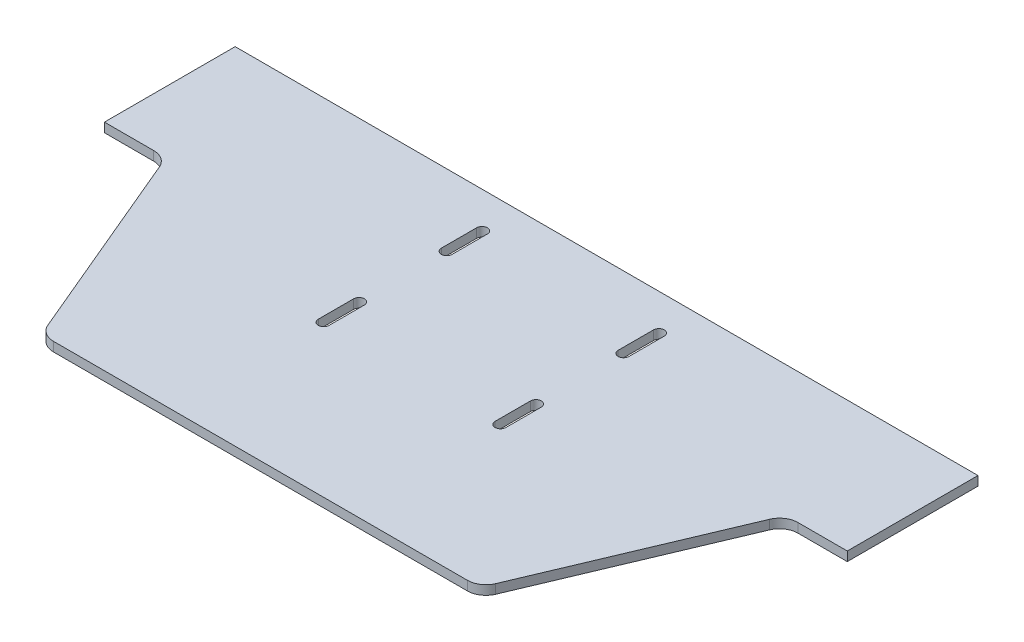
ISO-10303-21;
HEADER;
FILE_DESCRIPTION(('STEP AP214'),'2;1');
FILE_NAME('part.step','',(''),(''),'','','');
FILE_SCHEMA(('AUTOMOTIVE_DESIGN { 1 0 10303 214 1 1 1 1 }'));
ENDSEC;
DATA;
#1=APPLICATION_CONTEXT('core data for automotive mechanical design processes');
#2=APPLICATION_PROTOCOL_DEFINITION('international standard','automotive_design',2000,#1);
#3=PRODUCT_CONTEXT('',#1,'mechanical');
#4=PRODUCT('Part','Part','',(#3));
#5=PRODUCT_RELATED_PRODUCT_CATEGORY('part','',(#4));
#6=PRODUCT_DEFINITION_FORMATION('','',#4);
#7=PRODUCT_DEFINITION_CONTEXT('part definition',#1,'design');
#8=PRODUCT_DEFINITION('design','',#6,#7);
#9=PRODUCT_DEFINITION_SHAPE('','',#8);
#10=(LENGTH_UNIT() NAMED_UNIT(*) SI_UNIT(.MILLI.,.METRE.));
#11=(NAMED_UNIT(*) PLANE_ANGLE_UNIT() SI_UNIT($,.RADIAN.));
#12=(NAMED_UNIT(*) SI_UNIT($,.STERADIAN.) SOLID_ANGLE_UNIT());
#13=UNCERTAINTY_MEASURE_WITH_UNIT(LENGTH_MEASURE(1.E-05),#10,'distance_accuracy_value','');
#14=(GEOMETRIC_REPRESENTATION_CONTEXT(3) GLOBAL_UNCERTAINTY_ASSIGNED_CONTEXT((#13)) GLOBAL_UNIT_ASSIGNED_CONTEXT((#10,
#11,#12)) REPRESENTATION_CONTEXT('',''));
#15=CARTESIAN_POINT('',(0.,0.,0.));
#16=DIRECTION('',(0.,0.,1.));
#17=DIRECTION('',(1.,0.,0.));
#18=AXIS2_PLACEMENT_3D('',#15,#16,#17);
#19=CARTESIAN_POINT('',(-241.501482209097,-55.4959188693304,165.));
#20=DIRECTION('',(1.,0.,0.));
#21=DIRECTION('',(0.,0.,-1.));
#22=AXIS2_PLACEMENT_3D('',#19,#20,#21);
#23=PLANE('',#22);
#24=DIRECTION('',(0.,0.,1.));
#25=VECTOR('',#24,1.);
#26=CARTESIAN_POINT('',(-241.501482209097,-61.4959188693304,165.));
#27=LINE('',#26,#25);
#28=CARTESIAN_POINT('',(-241.501482209097,-61.4959188693304,80.));
#29=VERTEX_POINT('',#28);
#30=CARTESIAN_POINT('',(-241.501482209097,-61.4959188693304,165.));
#31=VERTEX_POINT('',#30);
#32=EDGE_CURVE('E345',#29,#31,#27,.T.);
#33=ORIENTED_EDGE('',*,*,#32,.T.);
#34=DIRECTION('',(0.,-1.,0.));
#35=VECTOR('',#34,1.);
#36=CARTESIAN_POINT('',(-241.501482209097,-55.4959188693304,165.));
#37=LINE('',#36,#35);
#38=CARTESIAN_POINT('',(-241.501482209097,-55.4959188693304,165.));
#39=VERTEX_POINT('',#38);
#40=EDGE_CURVE('E396',#39,#31,#37,.T.);
#41=ORIENTED_EDGE('',*,*,#40,.F.);
#42=DIRECTION('',(0.,0.,1.));
#43=VECTOR('',#42,1.);
#44=CARTESIAN_POINT('',(-241.501482209097,-55.4959188693304,165.));
#45=LINE('',#44,#43);
#46=CARTESIAN_POINT('',(-241.501482209097,-55.4959188693304,80.));
#47=VERTEX_POINT('',#46);
#48=EDGE_CURVE('E346',#47,#39,#45,.T.);
#49=ORIENTED_EDGE('',*,*,#48,.F.);
#50=DIRECTION('',(0.,-1.,0.));
#51=VECTOR('',#50,1.);
#52=CARTESIAN_POINT('',(-241.501482209097,-55.4959188693304,80.));
#53=LINE('',#52,#51);
#54=EDGE_CURVE('E368',#47,#29,#53,.T.);
#55=ORIENTED_EDGE('',*,*,#54,.T.);
#56=EDGE_LOOP('',(#33,#41,#49,#55));
#57=FACE_BOUND('',#56,.T.);
#58=ADVANCED_FACE('F32',(#57),#23,.F.);
#59=CARTESIAN_POINT('',(-201.501482209097,-55.4959188693304,165.));
#60=DIRECTION('',(0.,0.,-1.));
#61=DIRECTION('',(-1.,0.,0.));
#62=AXIS2_PLACEMENT_3D('',#59,#60,#61);
#63=PLANE('',#62);
#64=DIRECTION('',(1.,0.,0.));
#65=VECTOR('',#64,1.);
#66=CARTESIAN_POINT('',(-201.501482209097,-61.4959188693304,165.));
#67=LINE('',#66,#65);
#68=CARTESIAN_POINT('',(-209.466346496069,-61.4959188693304,165.));
#69=VERTEX_POINT('',#68);
#70=EDGE_CURVE('E371',#31,#69,#67,.T.);
#71=ORIENTED_EDGE('',*,*,#70,.T.);
#72=DIRECTION('',(0.,-1.,0.));
#73=VECTOR('',#72,1.);
#74=CARTESIAN_POINT('',(-209.466346496069,-55.4959188693304,165.));
#75=LINE('',#74,#73);
#76=CARTESIAN_POINT('',(-209.466346496069,-55.4959188693304,165.));
#77=VERTEX_POINT('',#76);
#78=EDGE_CURVE('E404',#69,#77,#75,.F.);
#79=ORIENTED_EDGE('',*,*,#78,.T.);
#80=DIRECTION('',(1.,0.,0.));
#81=VECTOR('',#80,1.);
#82=CARTESIAN_POINT('',(-201.501482209097,-55.4959188693304,165.));
#83=LINE('',#82,#81);
#84=EDGE_CURVE('E349',#39,#77,#83,.T.);
#85=ORIENTED_EDGE('',*,*,#84,.F.);
#86=ORIENTED_EDGE('',*,*,#40,.T.);
#87=EDGE_LOOP('',(#71,#79,#85,#86));
#88=FACE_BOUND('',#87,.T.);
#89=ADVANCED_FACE('F463',(#88),#63,.F.);
#90=CARTESIAN_POINT('',(-142.5,-55.4959188693304,305.));
#91=DIRECTION('',(0.921507935976713,0.,-0.388359529214797));
#92=DIRECTION('',(-0.388359529214797,0.,-0.921507935976713));
#93=AXIS2_PLACEMENT_3D('',#90,#91,#92);
#94=PLANE('',#93);
#95=DIRECTION('',(0.388359529214797,0.,0.921507935976713));
#96=VECTOR('',#95,1.);
#97=CARTESIAN_POINT('',(-142.5,-55.4959188693304,305.));
#98=LINE('',#97,#96);
#99=CARTESIAN_POINT('',(-198.408251264349,-55.4959188693304,172.339685649422));
#100=VERTEX_POINT('',#99);
#101=CARTESIAN_POINT('',(-145.593230944748,-55.4959188693304,297.660314350578));
#102=VERTEX_POINT('',#101);
#103=EDGE_CURVE('E353',#100,#102,#98,.T.);
#104=ORIENTED_EDGE('',*,*,#103,.F.);
#105=DIRECTION('',(0.,-1.,0.));
#106=VECTOR('',#105,1.);
#107=CARTESIAN_POINT('',(-198.408251264349,-61.4959188693304,172.339685649422));
#108=LINE('',#107,#106);
#109=CARTESIAN_POINT('',(-198.408251264349,-61.4959188693304,172.339685649422));
#110=VERTEX_POINT('',#109);
#111=EDGE_CURVE('E401',#100,#110,#108,.T.);
#112=ORIENTED_EDGE('',*,*,#111,.T.);
#113=DIRECTION('',(0.388359529214797,0.,0.921507935976713));
#114=VECTOR('',#113,1.);
#115=CARTESIAN_POINT('',(-142.5,-61.4959188693304,305.));
#116=LINE('',#115,#114);
#117=CARTESIAN_POINT('',(-145.593230944748,-61.4959188693304,297.660314350578));
#118=VERTEX_POINT('',#117);
#119=EDGE_CURVE('E374',#110,#118,#116,.T.);
#120=ORIENTED_EDGE('',*,*,#119,.T.);
#121=DIRECTION('',(0.,-1.,0.));
#122=VECTOR('',#121,1.);
#123=CARTESIAN_POINT('',(-145.593230944748,-55.4959188693304,297.660314350578));
#124=LINE('',#123,#122);
#125=EDGE_CURVE('E399',#118,#102,#124,.F.);
#126=ORIENTED_EDGE('',*,*,#125,.T.);
#127=EDGE_LOOP('',(#104,#112,#120,#126));
#128=FACE_BOUND('',#127,.T.);
#129=ADVANCED_FACE('F472',(#128),#94,.F.);
#130=CARTESIAN_POINT('',(142.5,-55.4959188693304,305.));
#131=DIRECTION('',(0.,0.,-1.));
#132=DIRECTION('',(-1.,0.,0.));
#133=AXIS2_PLACEMENT_3D('',#130,#131,#132);
#134=PLANE('',#133);
#135=DIRECTION('',(1.,0.,0.));
#136=VECTOR('',#135,1.);
#137=CARTESIAN_POINT('',(142.5,-55.4959188693304,305.));
#138=LINE('',#137,#136);
#139=CARTESIAN_POINT('',(-134.535135713028,-55.4959188693304,305.));
#140=VERTEX_POINT('',#139);
#141=CARTESIAN_POINT('',(134.535135713028,-55.4959188693304,305.));
#142=VERTEX_POINT('',#141);
#143=EDGE_CURVE('E356',#140,#142,#138,.T.);
#144=ORIENTED_EDGE('',*,*,#143,.F.);
#145=DIRECTION('',(0.,-1.,0.));
#146=VECTOR('',#145,1.);
#147=CARTESIAN_POINT('',(-134.535135713028,-55.4959188693304,305.));
#148=LINE('',#147,#146);
#149=CARTESIAN_POINT('',(-134.535135713028,-61.4959188693304,305.));
#150=VERTEX_POINT('',#149);
#151=EDGE_CURVE('E408',#140,#150,#148,.T.);
#152=ORIENTED_EDGE('',*,*,#151,.T.);
#153=DIRECTION('',(1.,0.,0.));
#154=VECTOR('',#153,1.);
#155=CARTESIAN_POINT('',(142.5,-61.4959188693304,305.));
#156=LINE('',#155,#154);
#157=CARTESIAN_POINT('',(134.535135713028,-61.4959188693304,305.));
#158=VERTEX_POINT('',#157);
#159=EDGE_CURVE('E377',#150,#158,#156,.T.);
#160=ORIENTED_EDGE('',*,*,#159,.T.);
#161=DIRECTION('',(0.,-1.,0.));
#162=VECTOR('',#161,1.);
#163=CARTESIAN_POINT('',(134.535135713028,-55.4959188693304,305.));
#164=LINE('',#163,#162);
#165=EDGE_CURVE('E406',#158,#142,#164,.F.);
#166=ORIENTED_EDGE('',*,*,#165,.T.);
#167=EDGE_LOOP('',(#144,#152,#160,#166));
#168=FACE_BOUND('',#167,.T.);
#169=ADVANCED_FACE('F480',(#168),#134,.F.);
#170=CARTESIAN_POINT('',(201.501482209097,-55.4959188693304,165.));
#171=DIRECTION('',(-0.921507935976713,0.,-0.388359529214797));
#172=DIRECTION('',(-0.388359529214797,0.,0.921507935976713));
#173=AXIS2_PLACEMENT_3D('',#170,#171,#172);
#174=PLANE('',#173);
#175=DIRECTION('',(0.388359529214797,0.,-0.921507935976713));
#176=VECTOR('',#175,1.);
#177=CARTESIAN_POINT('',(201.501482209097,-55.4959188693304,165.));
#178=LINE('',#177,#176);
#179=CARTESIAN_POINT('',(145.593230944748,-55.4959188693304,297.660314350577));
#180=VERTEX_POINT('',#179);
#181=CARTESIAN_POINT('',(198.408251264349,-55.4959188693304,172.339685649422));
#182=VERTEX_POINT('',#181);
#183=EDGE_CURVE('E359',#180,#182,#178,.T.);
#184=ORIENTED_EDGE('',*,*,#183,.F.);
#185=DIRECTION('',(0.,-1.,0.));
#186=VECTOR('',#185,1.);
#187=CARTESIAN_POINT('',(145.593230944748,-55.4959188693304,297.660314350578));
#188=LINE('',#187,#186);
#189=CARTESIAN_POINT('',(145.593230944748,-61.4959188693304,297.660314350577));
#190=VERTEX_POINT('',#189);
#191=EDGE_CURVE('E421',#180,#190,#188,.T.);
#192=ORIENTED_EDGE('',*,*,#191,.T.);
#193=DIRECTION('',(0.388359529214797,0.,-0.921507935976713));
#194=VECTOR('',#193,1.);
#195=CARTESIAN_POINT('',(201.501482209097,-61.4959188693304,165.));
#196=LINE('',#195,#194);
#197=CARTESIAN_POINT('',(198.408251264349,-61.4959188693304,172.339685649422));
#198=VERTEX_POINT('',#197);
#199=EDGE_CURVE('E380',#190,#198,#196,.T.);
#200=ORIENTED_EDGE('',*,*,#199,.T.);
#201=DIRECTION('',(0.,-1.,0.));
#202=VECTOR('',#201,1.);
#203=CARTESIAN_POINT('',(198.408251264349,-55.4959188693304,172.339685649422));
#204=LINE('',#203,#202);
#205=EDGE_CURVE('E419',#198,#182,#204,.F.);
#206=ORIENTED_EDGE('',*,*,#205,.T.);
#207=EDGE_LOOP('',(#184,#192,#200,#206));
#208=FACE_BOUND('',#207,.T.);
#209=ADVANCED_FACE('F441',(#208),#174,.F.);
#210=CARTESIAN_POINT('',(241.501482209097,-55.4959188693304,165.));
#211=DIRECTION('',(0.,0.,-1.));
#212=DIRECTION('',(-1.,0.,0.));
#213=AXIS2_PLACEMENT_3D('',#210,#211,#212);
#214=PLANE('',#213);
#215=DIRECTION('',(1.,0.,0.));
#216=VECTOR('',#215,1.);
#217=CARTESIAN_POINT('',(241.501482209097,-55.4959188693304,165.));
#218=LINE('',#217,#216);
#219=CARTESIAN_POINT('',(209.466346496069,-55.4959188693304,165.));
#220=VERTEX_POINT('',#219);
#221=CARTESIAN_POINT('',(241.501482209097,-55.4959188693304,165.));
#222=VERTEX_POINT('',#221);
#223=EDGE_CURVE('E362',#220,#222,#218,.T.);
#224=ORIENTED_EDGE('',*,*,#223,.F.);
#225=DIRECTION('',(0.,-1.,0.));
#226=VECTOR('',#225,1.);
#227=CARTESIAN_POINT('',(209.466346496069,-61.4959188693304,165.));
#228=LINE('',#227,#226);
#229=CARTESIAN_POINT('',(209.466346496069,-61.4959188693304,165.));
#230=VERTEX_POINT('',#229);
#231=EDGE_CURVE('E424',#220,#230,#228,.T.);
#232=ORIENTED_EDGE('',*,*,#231,.T.);
#233=DIRECTION('',(1.,0.,0.));
#234=VECTOR('',#233,1.);
#235=CARTESIAN_POINT('',(241.501482209097,-61.4959188693304,165.));
#236=LINE('',#235,#234);
#237=CARTESIAN_POINT('',(241.501482209097,-61.4959188693304,165.));
#238=VERTEX_POINT('',#237);
#239=EDGE_CURVE('E383',#230,#238,#236,.T.);
#240=ORIENTED_EDGE('',*,*,#239,.T.);
#241=DIRECTION('',(0.,-1.,0.));
#242=VECTOR('',#241,1.);
#243=CARTESIAN_POINT('',(241.501482209097,-55.4959188693304,165.));
#244=LINE('',#243,#242);
#245=EDGE_CURVE('E393',#222,#238,#244,.T.);
#246=ORIENTED_EDGE('',*,*,#245,.F.);
#247=EDGE_LOOP('',(#224,#232,#240,#246));
#248=FACE_BOUND('',#247,.T.);
#249=ADVANCED_FACE('F448',(#248),#214,.F.);
#250=CARTESIAN_POINT('',(241.501482209097,-55.4959188693304,80.));
#251=DIRECTION('',(-1.,0.,0.));
#252=DIRECTION('',(0.,0.,1.));
#253=AXIS2_PLACEMENT_3D('',#250,#251,#252);
#254=PLANE('',#253);
#255=DIRECTION('',(0.,0.,-1.));
#256=VECTOR('',#255,1.);
#257=CARTESIAN_POINT('',(241.501482209097,-61.4959188693304,80.));
#258=LINE('',#257,#256);
#259=CARTESIAN_POINT('',(241.501482209097,-61.4959188693304,80.));
#260=VERTEX_POINT('',#259);
#261=EDGE_CURVE('E385',#238,#260,#258,.T.);
#262=ORIENTED_EDGE('',*,*,#261,.T.);
#263=DIRECTION('',(0.,-1.,0.));
#264=VECTOR('',#263,1.);
#265=CARTESIAN_POINT('',(241.501482209097,-55.4959188693304,80.));
#266=LINE('',#265,#264);
#267=CARTESIAN_POINT('',(241.501482209097,-55.4959188693304,80.));
#268=VERTEX_POINT('',#267);
#269=EDGE_CURVE('E390',#268,#260,#266,.T.);
#270=ORIENTED_EDGE('',*,*,#269,.F.);
#271=DIRECTION('',(0.,0.,-1.));
#272=VECTOR('',#271,1.);
#273=CARTESIAN_POINT('',(241.501482209097,-55.4959188693304,80.));
#274=LINE('',#273,#272);
#275=EDGE_CURVE('E364',#222,#268,#274,.T.);
#276=ORIENTED_EDGE('',*,*,#275,.F.);
#277=ORIENTED_EDGE('',*,*,#245,.T.);
#278=EDGE_LOOP('',(#262,#270,#276,#277));
#279=FACE_BOUND('',#278,.T.);
#280=ADVANCED_FACE('F452',(#279),#254,.F.);
#281=CARTESIAN_POINT('',(-241.501482209097,-55.4959188693304,80.));
#282=DIRECTION('',(0.,0.,1.));
#283=DIRECTION('',(1.,0.,0.));
#284=AXIS2_PLACEMENT_3D('',#281,#282,#283);
#285=PLANE('',#284);
#286=DIRECTION('',(-1.,0.,0.));
#287=VECTOR('',#286,1.);
#288=CARTESIAN_POINT('',(-241.501482209097,-61.4959188693304,80.));
#289=LINE('',#288,#287);
#290=EDGE_CURVE('E350',#260,#29,#289,.T.);
#291=ORIENTED_EDGE('',*,*,#290,.T.);
#292=ORIENTED_EDGE('',*,*,#54,.F.);
#293=DIRECTION('',(-1.,0.,0.));
#294=VECTOR('',#293,1.);
#295=CARTESIAN_POINT('',(-241.501482209097,-55.4959188693304,80.));
#296=LINE('',#295,#294);
#297=EDGE_CURVE('E366',#268,#47,#296,.T.);
#298=ORIENTED_EDGE('',*,*,#297,.F.);
#299=ORIENTED_EDGE('',*,*,#269,.T.);
#300=EDGE_LOOP('',(#291,#292,#298,#299));
#301=FACE_BOUND('',#300,.T.);
#302=ADVANCED_FACE('F458',(#301),#285,.F.);
#303=CARTESIAN_POINT('',(-241.501482209097,-55.4959188693304,80.));
#304=DIRECTION('',(0.,-1.,0.));
#305=DIRECTION('',(0.,0.,-1.));
#306=AXIS2_PLACEMENT_3D('',#303,#304,#305);
#307=PLANE('',#306);
#308=DIRECTION('',(0.,0.,1.));
#309=VECTOR('',#308,1.);
#310=CARTESIAN_POINT('',(54.,-55.4959188693304,206.472135954998));
#311=LINE('',#310,#309);
#312=CARTESIAN_POINT('',(54.,-55.4959188693304,183.472135954998));
#313=VERTEX_POINT('',#312);
#314=CARTESIAN_POINT('',(54.,-55.4959188693304,206.472135954998));
#315=VERTEX_POINT('',#314);
#316=EDGE_CURVE('E236',#313,#315,#311,.T.);
#317=ORIENTED_EDGE('',*,*,#316,.F.);
#318=CARTESIAN_POINT('',(57.5,-55.4959188693304,183.472135954998));
#319=DIRECTION('',(0.,-1.,0.));
#320=DIRECTION('',(0.,0.,-1.));
#321=AXIS2_PLACEMENT_3D('',#318,#319,#320);
#322=CIRCLE('',#321,3.50000000000001);
#323=CARTESIAN_POINT('',(61.,-55.4959188693304,183.472135954998));
#324=VERTEX_POINT('',#323);
#325=EDGE_CURVE('E218',#324,#313,#322,.F.);
#326=ORIENTED_EDGE('',*,*,#325,.F.);
#327=DIRECTION('',(0.,0.,-1.));
#328=VECTOR('',#327,1.);
#329=CARTESIAN_POINT('',(61.,-55.4959188693304,183.472135954998));
#330=LINE('',#329,#328);
#331=CARTESIAN_POINT('',(61.,-55.4959188693304,206.472135954998));
#332=VERTEX_POINT('',#331);
#333=EDGE_CURVE('E227',#332,#324,#330,.T.);
#334=ORIENTED_EDGE('',*,*,#333,.F.);
#335=CARTESIAN_POINT('',(57.5,-55.4959188693304,206.472135954998));
#336=DIRECTION('',(0.,-1.,0.));
#337=DIRECTION('',(0.,0.,-1.));
#338=AXIS2_PLACEMENT_3D('',#335,#336,#337);
#339=CIRCLE('',#338,3.50000000000001);
#340=EDGE_CURVE('E47',#315,#332,#339,.F.);
#341=ORIENTED_EDGE('',*,*,#340,.F.);
#342=EDGE_LOOP('',(#317,#326,#334,#341));
#343=FACE_BOUND('',#342,.T.);
#344=DIRECTION('',(0.,0.,-1.));
#345=VECTOR('',#344,1.);
#346=CARTESIAN_POINT('',(61.,-55.4959188693304,126.472135954998));
#347=LINE('',#346,#345);
#348=CARTESIAN_POINT('',(61.,-55.4959188693304,126.472135954998));
#349=VERTEX_POINT('',#348);
#350=CARTESIAN_POINT('',(61.,-55.4959188693304,103.472135954998));
#351=VERTEX_POINT('',#350);
#352=EDGE_CURVE('E254',#349,#351,#347,.T.);
#353=ORIENTED_EDGE('',*,*,#352,.F.);
#354=CARTESIAN_POINT('',(57.5,-55.4959188693304,126.472135954998));
#355=DIRECTION('',(0.,-1.,0.));
#356=DIRECTION('',(0.,0.,-1.));
#357=AXIS2_PLACEMENT_3D('',#354,#355,#356);
#358=CIRCLE('',#357,3.50000000000001);
#359=CARTESIAN_POINT('',(54.,-55.4959188693304,126.472135954998));
#360=VERTEX_POINT('',#359);
#361=EDGE_CURVE('E257',#360,#349,#358,.F.);
#362=ORIENTED_EDGE('',*,*,#361,.F.);
#363=DIRECTION('',(0.,0.,1.));
#364=VECTOR('',#363,1.);
#365=CARTESIAN_POINT('',(54.,-55.4959188693304,103.472135954998));
#366=LINE('',#365,#364);
#367=CARTESIAN_POINT('',(54.,-55.4959188693304,103.472135954998));
#368=VERTEX_POINT('',#367);
#369=EDGE_CURVE('E274',#368,#360,#366,.T.);
#370=ORIENTED_EDGE('',*,*,#369,.F.);
#371=CARTESIAN_POINT('',(57.5,-55.4959188693304,103.472135954998));
#372=DIRECTION('',(0.,-1.,0.));
#373=DIRECTION('',(0.,0.,-1.));
#374=AXIS2_PLACEMENT_3D('',#371,#372,#373);
#375=CIRCLE('',#374,3.50000000000001);
#376=EDGE_CURVE('E230',#351,#368,#375,.F.);
#377=ORIENTED_EDGE('',*,*,#376,.F.);
#378=EDGE_LOOP('',(#353,#362,#370,#377));
#379=FACE_BOUND('',#378,.T.);
#380=DIRECTION('',(0.,0.,1.));
#381=VECTOR('',#380,1.);
#382=CARTESIAN_POINT('',(-61.,-55.4959188693304,126.472135954998));
#383=LINE('',#382,#381);
#384=CARTESIAN_POINT('',(-61.,-55.4959188693304,103.472135954998));
#385=VERTEX_POINT('',#384);
#386=CARTESIAN_POINT('',(-61.,-55.4959188693304,126.472135954998));
#387=VERTEX_POINT('',#386);
#388=EDGE_CURVE('E285',#385,#387,#383,.T.);
#389=ORIENTED_EDGE('',*,*,#388,.F.);
#390=CARTESIAN_POINT('',(-57.5,-55.4959188693304,103.472135954998));
#391=DIRECTION('',(0.,-1.,0.));
#392=DIRECTION('',(0.,0.,-1.));
#393=AXIS2_PLACEMENT_3D('',#390,#391,#392);
#394=CIRCLE('',#393,3.5);
#395=CARTESIAN_POINT('',(-54.,-55.4959188693304,103.472135954998));
#396=VERTEX_POINT('',#395);
#397=EDGE_CURVE('E288',#396,#385,#394,.F.);
#398=ORIENTED_EDGE('',*,*,#397,.F.);
#399=DIRECTION('',(0.,0.,-1.));
#400=VECTOR('',#399,1.);
#401=CARTESIAN_POINT('',(-54.,-55.4959188693304,103.472135954998));
#402=LINE('',#401,#400);
#403=CARTESIAN_POINT('',(-54.,-55.4959188693304,126.472135954998));
#404=VERTEX_POINT('',#403);
#405=EDGE_CURVE('E305',#404,#396,#402,.T.);
#406=ORIENTED_EDGE('',*,*,#405,.F.);
#407=CARTESIAN_POINT('',(-57.5,-55.4959188693304,126.472135954998));
#408=DIRECTION('',(0.,-1.,0.));
#409=DIRECTION('',(0.,0.,-1.));
#410=AXIS2_PLACEMENT_3D('',#407,#408,#409);
#411=CIRCLE('',#410,3.5);
#412=EDGE_CURVE('E283',#387,#404,#411,.F.);
#413=ORIENTED_EDGE('',*,*,#412,.F.);
#414=EDGE_LOOP('',(#389,#398,#406,#413));
#415=FACE_BOUND('',#414,.T.);
#416=DIRECTION('',(0.,0.,1.));
#417=VECTOR('',#416,1.);
#418=CARTESIAN_POINT('',(-61.,-55.4959188693304,183.472135954998));
#419=LINE('',#418,#417);
#420=CARTESIAN_POINT('',(-61.,-55.4959188693304,183.472135954998));
#421=VERTEX_POINT('',#420);
#422=CARTESIAN_POINT('',(-61.,-55.4959188693304,206.472135954998));
#423=VERTEX_POINT('',#422);
#424=EDGE_CURVE('E316',#421,#423,#419,.T.);
#425=ORIENTED_EDGE('',*,*,#424,.F.);
#426=CARTESIAN_POINT('',(-57.5,-55.4959188693304,183.472135954998));
#427=DIRECTION('',(0.,-1.,0.));
#428=DIRECTION('',(0.,0.,-1.));
#429=AXIS2_PLACEMENT_3D('',#426,#427,#428);
#430=CIRCLE('',#429,3.5);
#431=CARTESIAN_POINT('',(-54.,-55.4959188693304,183.472135954998));
#432=VERTEX_POINT('',#431);
#433=EDGE_CURVE('E319',#432,#421,#430,.F.);
#434=ORIENTED_EDGE('',*,*,#433,.F.);
#435=DIRECTION('',(0.,0.,-1.));
#436=VECTOR('',#435,1.);
#437=CARTESIAN_POINT('',(-54.,-55.4959188693304,206.472135954998));
#438=LINE('',#437,#436);
#439=CARTESIAN_POINT('',(-54.,-55.4959188693304,206.472135954998));
#440=VERTEX_POINT('',#439);
#441=EDGE_CURVE('E336',#440,#432,#438,.T.);
#442=ORIENTED_EDGE('',*,*,#441,.F.);
#443=CARTESIAN_POINT('',(-57.5,-55.4959188693304,206.472135954998));
#444=DIRECTION('',(0.,-1.,0.));
#445=DIRECTION('',(0.,0.,-1.));
#446=AXIS2_PLACEMENT_3D('',#443,#444,#445);
#447=CIRCLE('',#446,3.50000000000001);
#448=EDGE_CURVE('E314',#423,#440,#447,.F.);
#449=ORIENTED_EDGE('',*,*,#448,.F.);
#450=EDGE_LOOP('',(#425,#434,#442,#449));
#451=FACE_BOUND('',#450,.T.);
#452=ORIENTED_EDGE('',*,*,#103,.T.);
#453=CARTESIAN_POINT('',(-134.535135713028,-55.4959188693304,293.));
#454=DIRECTION('',(0.,-1.,0.));
#455=DIRECTION('',(0.,0.,-1.));
#456=AXIS2_PLACEMENT_3D('',#453,#454,#455);
#457=CIRCLE('',#456,12.);
#458=EDGE_CURVE('E417',#102,#140,#457,.F.);
#459=ORIENTED_EDGE('',*,*,#458,.T.);
#460=ORIENTED_EDGE('',*,*,#143,.T.);
#461=CARTESIAN_POINT('',(134.535135713028,-55.4959188693304,293.));
#462=DIRECTION('',(0.,-1.,0.));
#463=DIRECTION('',(0.,0.,-1.));
#464=AXIS2_PLACEMENT_3D('',#461,#462,#463);
#465=CIRCLE('',#464,12.);
#466=EDGE_CURVE('E415',#142,#180,#465,.F.);
#467=ORIENTED_EDGE('',*,*,#466,.T.);
#468=ORIENTED_EDGE('',*,*,#183,.T.);
#469=CARTESIAN_POINT('',(209.466346496069,-55.4959188693304,177.));
#470=DIRECTION('',(0.,-1.,0.));
#471=DIRECTION('',(0.,0.,-1.));
#472=AXIS2_PLACEMENT_3D('',#469,#470,#471);
#473=CIRCLE('',#472,12.);
#474=EDGE_CURVE('E11',#182,#220,#473,.T.);
#475=ORIENTED_EDGE('',*,*,#474,.T.);
#476=ORIENTED_EDGE('',*,*,#223,.T.);
#477=ORIENTED_EDGE('',*,*,#275,.T.);
#478=ORIENTED_EDGE('',*,*,#297,.T.);
#479=ORIENTED_EDGE('',*,*,#48,.T.);
#480=ORIENTED_EDGE('',*,*,#84,.T.);
#481=CARTESIAN_POINT('',(-209.466346496069,-55.4959188693304,177.));
#482=DIRECTION('',(0.,-1.,0.));
#483=DIRECTION('',(0.,0.,-1.));
#484=AXIS2_PLACEMENT_3D('',#481,#482,#483);
#485=CIRCLE('',#484,12.);
#486=EDGE_CURVE('E429',#77,#100,#485,.T.);
#487=ORIENTED_EDGE('',*,*,#486,.T.);
#488=EDGE_LOOP('',(#452,#459,#460,#467,#468,#475,#476,#477,#478,#479,#480,#487));
#489=FACE_BOUND('',#488,.T.);
#490=ADVANCED_FACE('F233',(#343,#379,#415,#451,#489),#307,.F.);
#491=CARTESIAN_POINT('',(-241.501482209097,-61.4959188693304,80.));
#492=DIRECTION('',(0.,-1.,0.));
#493=DIRECTION('',(0.,0.,-1.));
#494=AXIS2_PLACEMENT_3D('',#491,#492,#493);
#495=PLANE('',#494);
#496=CARTESIAN_POINT('',(57.5,-61.4959188693304,183.472135954998));
#497=DIRECTION('',(0.,-1.,0.));
#498=DIRECTION('',(0.,0.,1.));
#499=AXIS2_PLACEMENT_3D('',#496,#497,#498);
#500=CIRCLE('',#499,3.50000000000001);
#501=CARTESIAN_POINT('',(54.,-61.4959188693304,183.472135954998));
#502=VERTEX_POINT('',#501);
#503=CARTESIAN_POINT('',(61.,-61.4959188693304,183.472135954998));
#504=VERTEX_POINT('',#503);
#505=EDGE_CURVE('E55',#502,#504,#500,.T.);
#506=ORIENTED_EDGE('',*,*,#505,.F.);
#507=DIRECTION('',(0.,0.,-1.));
#508=VECTOR('',#507,1.);
#509=CARTESIAN_POINT('',(54.,-61.4959188693304,206.472135954998));
#510=LINE('',#509,#508);
#511=CARTESIAN_POINT('',(54.,-61.4959188693304,206.472135954998));
#512=VERTEX_POINT('',#511);
#513=EDGE_CURVE('E224',#512,#502,#510,.T.);
#514=ORIENTED_EDGE('',*,*,#513,.F.);
#515=CARTESIAN_POINT('',(57.5,-61.4959188693304,206.472135954998));
#516=DIRECTION('',(0.,-1.,0.));
#517=DIRECTION('',(0.,0.,1.));
#518=AXIS2_PLACEMENT_3D('',#515,#516,#517);
#519=CIRCLE('',#518,3.50000000000001);
#520=CARTESIAN_POINT('',(61.,-61.4959188693304,206.472135954998));
#521=VERTEX_POINT('',#520);
#522=EDGE_CURVE('E244',#521,#512,#519,.T.);
#523=ORIENTED_EDGE('',*,*,#522,.F.);
#524=DIRECTION('',(0.,0.,1.));
#525=VECTOR('',#524,1.);
#526=CARTESIAN_POINT('',(61.,-61.4959188693304,183.472135954998));
#527=LINE('',#526,#525);
#528=EDGE_CURVE('E238',#504,#521,#527,.T.);
#529=ORIENTED_EDGE('',*,*,#528,.F.);
#530=EDGE_LOOP('',(#506,#514,#523,#529));
#531=FACE_BOUND('',#530,.T.);
#532=CARTESIAN_POINT('',(57.5,-61.4959188693304,126.472135954998));
#533=DIRECTION('',(0.,-1.,0.));
#534=DIRECTION('',(0.,0.,-1.));
#535=AXIS2_PLACEMENT_3D('',#532,#533,#534);
#536=CIRCLE('',#535,3.50000000000001);
#537=CARTESIAN_POINT('',(61.,-61.4959188693304,126.472135954998));
#538=VERTEX_POINT('',#537);
#539=CARTESIAN_POINT('',(54.,-61.4959188693304,126.472135954998));
#540=VERTEX_POINT('',#539);
#541=EDGE_CURVE('E260',#538,#540,#536,.T.);
#542=ORIENTED_EDGE('',*,*,#541,.F.);
#543=DIRECTION('',(0.,0.,1.));
#544=VECTOR('',#543,1.);
#545=CARTESIAN_POINT('',(61.,-61.4959188693304,126.472135954998));
#546=LINE('',#545,#544);
#547=CARTESIAN_POINT('',(61.,-61.4959188693304,103.472135954998));
#548=VERTEX_POINT('',#547);
#549=EDGE_CURVE('E268',#548,#538,#546,.T.);
#550=ORIENTED_EDGE('',*,*,#549,.F.);
#551=CARTESIAN_POINT('',(57.5,-61.4959188693304,103.472135954998));
#552=DIRECTION('',(0.,-1.,0.));
#553=DIRECTION('',(0.,0.,-1.));
#554=AXIS2_PLACEMENT_3D('',#551,#552,#553);
#555=CIRCLE('',#554,3.50000000000001);
#556=CARTESIAN_POINT('',(54.,-61.4959188693304,103.472135954998));
#557=VERTEX_POINT('',#556);
#558=EDGE_CURVE('E265',#557,#548,#555,.T.);
#559=ORIENTED_EDGE('',*,*,#558,.F.);
#560=DIRECTION('',(0.,0.,-1.));
#561=VECTOR('',#560,1.);
#562=CARTESIAN_POINT('',(54.,-61.4959188693304,103.472135954998));
#563=LINE('',#562,#561);
#564=EDGE_CURVE('E262',#540,#557,#563,.T.);
#565=ORIENTED_EDGE('',*,*,#564,.F.);
#566=EDGE_LOOP('',(#542,#550,#559,#565));
#567=FACE_BOUND('',#566,.T.);
#568=CARTESIAN_POINT('',(-57.5,-61.4959188693304,103.472135954998));
#569=DIRECTION('',(0.,-1.,0.));
#570=DIRECTION('',(0.,0.,1.));
#571=AXIS2_PLACEMENT_3D('',#568,#569,#570);
#572=CIRCLE('',#571,3.5);
#573=CARTESIAN_POINT('',(-61.,-61.4959188693304,103.472135954998));
#574=VERTEX_POINT('',#573);
#575=CARTESIAN_POINT('',(-54.,-61.4959188693304,103.472135954998));
#576=VERTEX_POINT('',#575);
#577=EDGE_CURVE('E291',#574,#576,#572,.T.);
#578=ORIENTED_EDGE('',*,*,#577,.F.);
#579=DIRECTION('',(0.,0.,-1.));
#580=VECTOR('',#579,1.);
#581=CARTESIAN_POINT('',(-61.,-61.4959188693304,126.472135954998));
#582=LINE('',#581,#580);
#583=CARTESIAN_POINT('',(-61.,-61.4959188693304,126.472135954998));
#584=VERTEX_POINT('',#583);
#585=EDGE_CURVE('E299',#584,#574,#582,.T.);
#586=ORIENTED_EDGE('',*,*,#585,.F.);
#587=CARTESIAN_POINT('',(-57.5,-61.4959188693304,126.472135954998));
#588=DIRECTION('',(0.,-1.,0.));
#589=DIRECTION('',(0.,0.,1.));
#590=AXIS2_PLACEMENT_3D('',#587,#588,#589);
#591=CIRCLE('',#590,3.5);
#592=CARTESIAN_POINT('',(-54.,-61.4959188693304,126.472135954998));
#593=VERTEX_POINT('',#592);
#594=EDGE_CURVE('E296',#593,#584,#591,.T.);
#595=ORIENTED_EDGE('',*,*,#594,.F.);
#596=DIRECTION('',(0.,0.,1.));
#597=VECTOR('',#596,1.);
#598=CARTESIAN_POINT('',(-54.,-61.4959188693304,103.472135954998));
#599=LINE('',#598,#597);
#600=EDGE_CURVE('E293',#576,#593,#599,.T.);
#601=ORIENTED_EDGE('',*,*,#600,.F.);
#602=EDGE_LOOP('',(#578,#586,#595,#601));
#603=FACE_BOUND('',#602,.T.);
#604=CARTESIAN_POINT('',(-57.5,-61.4959188693304,183.472135954998));
#605=DIRECTION('',(0.,-1.,0.));
#606=DIRECTION('',(0.,0.,-1.));
#607=AXIS2_PLACEMENT_3D('',#604,#605,#606);
#608=CIRCLE('',#607,3.5);
#609=CARTESIAN_POINT('',(-61.,-61.4959188693304,183.472135954998));
#610=VERTEX_POINT('',#609);
#611=CARTESIAN_POINT('',(-54.,-61.4959188693304,183.472135954998));
#612=VERTEX_POINT('',#611);
#613=EDGE_CURVE('E322',#610,#612,#608,.T.);
#614=ORIENTED_EDGE('',*,*,#613,.F.);
#615=DIRECTION('',(0.,0.,-1.));
#616=VECTOR('',#615,1.);
#617=CARTESIAN_POINT('',(-61.,-61.4959188693304,183.472135954998));
#618=LINE('',#617,#616);
#619=CARTESIAN_POINT('',(-61.,-61.4959188693304,206.472135954998));
#620=VERTEX_POINT('',#619);
#621=EDGE_CURVE('E330',#620,#610,#618,.T.);
#622=ORIENTED_EDGE('',*,*,#621,.F.);
#623=CARTESIAN_POINT('',(-57.5,-61.4959188693304,206.472135954998));
#624=DIRECTION('',(0.,-1.,0.));
#625=DIRECTION('',(0.,0.,-1.));
#626=AXIS2_PLACEMENT_3D('',#623,#624,#625);
#627=CIRCLE('',#626,3.50000000000001);
#628=CARTESIAN_POINT('',(-54.,-61.4959188693304,206.472135954998));
#629=VERTEX_POINT('',#628);
#630=EDGE_CURVE('E327',#629,#620,#627,.T.);
#631=ORIENTED_EDGE('',*,*,#630,.F.);
#632=DIRECTION('',(0.,0.,1.));
#633=VECTOR('',#632,1.);
#634=CARTESIAN_POINT('',(-54.,-61.4959188693304,206.472135954998));
#635=LINE('',#634,#633);
#636=EDGE_CURVE('E324',#612,#629,#635,.T.);
#637=ORIENTED_EDGE('',*,*,#636,.F.);
#638=EDGE_LOOP('',(#614,#622,#631,#637));
#639=FACE_BOUND('',#638,.T.);
#640=ORIENTED_EDGE('',*,*,#159,.F.);
#641=CARTESIAN_POINT('',(-134.535135713028,-61.4959188693304,293.));
#642=DIRECTION('',(0.,-1.,0.));
#643=DIRECTION('',(0.,0.,-1.));
#644=AXIS2_PLACEMENT_3D('',#641,#642,#643);
#645=CIRCLE('',#644,12.);
#646=EDGE_CURVE('E413',#150,#118,#645,.T.);
#647=ORIENTED_EDGE('',*,*,#646,.T.);
#648=ORIENTED_EDGE('',*,*,#119,.F.);
#649=CARTESIAN_POINT('',(-209.466346496069,-61.4959188693304,177.));
#650=DIRECTION('',(0.,-1.,0.));
#651=DIRECTION('',(0.,0.,-1.));
#652=AXIS2_PLACEMENT_3D('',#649,#650,#651);
#653=CIRCLE('',#652,12.);
#654=EDGE_CURVE('E427',#110,#69,#653,.F.);
#655=ORIENTED_EDGE('',*,*,#654,.T.);
#656=ORIENTED_EDGE('',*,*,#70,.F.);
#657=ORIENTED_EDGE('',*,*,#32,.F.);
#658=ORIENTED_EDGE('',*,*,#290,.F.);
#659=ORIENTED_EDGE('',*,*,#261,.F.);
#660=ORIENTED_EDGE('',*,*,#239,.F.);
#661=CARTESIAN_POINT('',(209.466346496069,-61.4959188693304,177.));
#662=DIRECTION('',(0.,-1.,0.));
#663=DIRECTION('',(0.,0.,-1.));
#664=AXIS2_PLACEMENT_3D('',#661,#662,#663);
#665=CIRCLE('',#664,12.);
#666=EDGE_CURVE('E40',#230,#198,#665,.F.);
#667=ORIENTED_EDGE('',*,*,#666,.T.);
#668=ORIENTED_EDGE('',*,*,#199,.F.);
#669=CARTESIAN_POINT('',(134.535135713028,-61.4959188693304,293.));
#670=DIRECTION('',(0.,-1.,0.));
#671=DIRECTION('',(0.,0.,-1.));
#672=AXIS2_PLACEMENT_3D('',#669,#670,#671);
#673=CIRCLE('',#672,12.);
#674=EDGE_CURVE('E411',#190,#158,#673,.T.);
#675=ORIENTED_EDGE('',*,*,#674,.T.);
#676=EDGE_LOOP('',(#640,#647,#648,#655,#656,#657,#658,#659,#660,#667,#668,#675));
#677=FACE_BOUND('',#676,.T.);
#678=ADVANCED_FACE('F434',(#531,#567,#603,#639,#677),#495,.T.);
#679=CARTESIAN_POINT('',(-209.466346496069,-55.4959188693304,177.));
#680=DIRECTION('',(0.,1.,0.));
#681=DIRECTION('',(-1.,0.,0.));
#682=AXIS2_PLACEMENT_3D('',#679,#680,#681);
#683=CYLINDRICAL_SURFACE('',#682,12.);
#684=ORIENTED_EDGE('',*,*,#486,.F.);
#685=ORIENTED_EDGE('',*,*,#78,.F.);
#686=ORIENTED_EDGE('',*,*,#654,.F.);
#687=ORIENTED_EDGE('',*,*,#111,.F.);
#688=EDGE_LOOP('',(#684,#685,#686,#687));
#689=FACE_BOUND('',#688,.T.);
#690=ADVANCED_FACE('F469',(#689),#683,.F.);
#691=CARTESIAN_POINT('',(-134.535135713028,-55.4959188693304,293.));
#692=DIRECTION('',(0.,-1.,0.));
#693=DIRECTION('',(1.,0.,0.));
#694=AXIS2_PLACEMENT_3D('',#691,#692,#693);
#695=CYLINDRICAL_SURFACE('',#694,12.);
#696=ORIENTED_EDGE('',*,*,#458,.F.);
#697=ORIENTED_EDGE('',*,*,#125,.F.);
#698=ORIENTED_EDGE('',*,*,#646,.F.);
#699=ORIENTED_EDGE('',*,*,#151,.F.);
#700=EDGE_LOOP('',(#696,#697,#698,#699));
#701=FACE_BOUND('',#700,.T.);
#702=ADVANCED_FACE('F477',(#701),#695,.T.);
#703=CARTESIAN_POINT('',(134.535135713028,-55.4959188693304,293.));
#704=DIRECTION('',(0.,-1.,0.));
#705=DIRECTION('',(1.,0.,0.));
#706=AXIS2_PLACEMENT_3D('',#703,#704,#705);
#707=CYLINDRICAL_SURFACE('',#706,12.);
#708=ORIENTED_EDGE('',*,*,#466,.F.);
#709=ORIENTED_EDGE('',*,*,#165,.F.);
#710=ORIENTED_EDGE('',*,*,#674,.F.);
#711=ORIENTED_EDGE('',*,*,#191,.F.);
#712=EDGE_LOOP('',(#708,#709,#710,#711));
#713=FACE_BOUND('',#712,.T.);
#714=ADVANCED_FACE('F484',(#713),#707,.T.);
#715=CARTESIAN_POINT('',(209.466346496069,-55.4959188693304,177.));
#716=DIRECTION('',(0.,1.,0.));
#717=DIRECTION('',(-1.,0.,0.));
#718=AXIS2_PLACEMENT_3D('',#715,#716,#717);
#719=CYLINDRICAL_SURFACE('',#718,12.);
#720=ORIENTED_EDGE('',*,*,#474,.F.);
#721=ORIENTED_EDGE('',*,*,#205,.F.);
#722=ORIENTED_EDGE('',*,*,#666,.F.);
#723=ORIENTED_EDGE('',*,*,#231,.F.);
#724=EDGE_LOOP('',(#720,#721,#722,#723));
#725=FACE_BOUND('',#724,.T.);
#726=ADVANCED_FACE('F34',(#725),#719,.F.);
#727=CARTESIAN_POINT('',(-57.5,358.50508113067,183.472135954998));
#728=DIRECTION('',(0.,-1.,0.));
#729=DIRECTION('',(0.,0.,-1.));
#730=AXIS2_PLACEMENT_3D('',#727,#728,#729);
#731=CYLINDRICAL_SURFACE('',#730,3.5);
#732=ORIENTED_EDGE('',*,*,#433,.T.);
#733=DIRECTION('',(0.,-1.,0.));
#734=VECTOR('',#733,1.);
#735=CARTESIAN_POINT('',(-61.,358.50508113067,183.472135954998));
#736=LINE('',#735,#734);
#737=EDGE_CURVE('E334',#421,#610,#736,.T.);
#738=ORIENTED_EDGE('',*,*,#737,.T.);
#739=ORIENTED_EDGE('',*,*,#613,.T.);
#740=DIRECTION('',(0.,-1.,0.));
#741=VECTOR('',#740,1.);
#742=CARTESIAN_POINT('',(-54.,358.50508113067,183.472135954998));
#743=LINE('',#742,#741);
#744=EDGE_CURVE('E333',#432,#612,#743,.T.);
#745=ORIENTED_EDGE('',*,*,#744,.F.);
#746=EDGE_LOOP('',(#732,#738,#739,#745));
#747=FACE_BOUND('',#746,.T.);
#748=ADVANCED_FACE('F490',(#747),#731,.F.);
#749=CARTESIAN_POINT('',(-61.,358.50508113067,183.472135954998));
#750=DIRECTION('',(-1.,0.,0.));
#751=DIRECTION('',(0.,0.,1.));
#752=AXIS2_PLACEMENT_3D('',#749,#750,#751);
#753=PLANE('',#752);
#754=ORIENTED_EDGE('',*,*,#424,.T.);
#755=DIRECTION('',(0.,-1.,0.));
#756=VECTOR('',#755,1.);
#757=CARTESIAN_POINT('',(-61.,358.50508113067,206.472135954998));
#758=LINE('',#757,#756);
#759=EDGE_CURVE('E337',#423,#620,#758,.T.);
#760=ORIENTED_EDGE('',*,*,#759,.T.);
#761=ORIENTED_EDGE('',*,*,#621,.T.);
#762=ORIENTED_EDGE('',*,*,#737,.F.);
#763=EDGE_LOOP('',(#754,#760,#761,#762));
#764=FACE_BOUND('',#763,.T.);
#765=ADVANCED_FACE('F593',(#764),#753,.F.);
#766=CARTESIAN_POINT('',(-57.5,358.50508113067,206.472135954998));
#767=DIRECTION('',(0.,-1.,0.));
#768=DIRECTION('',(0.,0.,-1.));
#769=AXIS2_PLACEMENT_3D('',#766,#767,#768);
#770=CYLINDRICAL_SURFACE('',#769,3.50000000000001);
#771=ORIENTED_EDGE('',*,*,#448,.T.);
#772=DIRECTION('',(0.,-1.,0.));
#773=VECTOR('',#772,1.);
#774=CARTESIAN_POINT('',(-54.,358.50508113067,206.472135954998));
#775=LINE('',#774,#773);
#776=EDGE_CURVE('E339',#440,#629,#775,.T.);
#777=ORIENTED_EDGE('',*,*,#776,.T.);
#778=ORIENTED_EDGE('',*,*,#630,.T.);
#779=ORIENTED_EDGE('',*,*,#759,.F.);
#780=EDGE_LOOP('',(#771,#777,#778,#779));
#781=FACE_BOUND('',#780,.T.);
#782=ADVANCED_FACE('F602',(#781),#770,.F.);
#783=CARTESIAN_POINT('',(-54.,358.50508113067,206.472135954998));
#784=DIRECTION('',(1.,0.,0.));
#785=DIRECTION('',(0.,0.,-1.));
#786=AXIS2_PLACEMENT_3D('',#783,#784,#785);
#787=PLANE('',#786);
#788=ORIENTED_EDGE('',*,*,#441,.T.);
#789=ORIENTED_EDGE('',*,*,#744,.T.);
#790=ORIENTED_EDGE('',*,*,#636,.T.);
#791=ORIENTED_EDGE('',*,*,#776,.F.);
#792=EDGE_LOOP('',(#788,#789,#790,#791));
#793=FACE_BOUND('',#792,.T.);
#794=ADVANCED_FACE('F612',(#793),#787,.F.);
#795=CARTESIAN_POINT('',(-57.5,358.50508113067,103.472135954998));
#796=DIRECTION('',(0.,-1.,0.));
#797=DIRECTION('',(0.,0.,-1.));
#798=AXIS2_PLACEMENT_3D('',#795,#796,#797);
#799=CYLINDRICAL_SURFACE('',#798,3.5);
#800=ORIENTED_EDGE('',*,*,#397,.T.);
#801=DIRECTION('',(0.,-1.,0.));
#802=VECTOR('',#801,1.);
#803=CARTESIAN_POINT('',(-61.,358.50508113067,103.472135954998));
#804=LINE('',#803,#802);
#805=EDGE_CURVE('E303',#385,#574,#804,.T.);
#806=ORIENTED_EDGE('',*,*,#805,.T.);
#807=ORIENTED_EDGE('',*,*,#577,.T.);
#808=DIRECTION('',(0.,-1.,0.));
#809=VECTOR('',#808,1.);
#810=CARTESIAN_POINT('',(-54.,358.50508113067,103.472135954998));
#811=LINE('',#810,#809);
#812=EDGE_CURVE('E302',#396,#576,#811,.T.);
#813=ORIENTED_EDGE('',*,*,#812,.F.);
#814=EDGE_LOOP('',(#800,#806,#807,#813));
#815=FACE_BOUND('',#814,.T.);
#816=ADVANCED_FACE('F622',(#815),#799,.F.);
#817=CARTESIAN_POINT('',(-61.,358.50508113067,126.472135954998));
#818=DIRECTION('',(-1.,0.,0.));
#819=DIRECTION('',(0.,0.,1.));
#820=AXIS2_PLACEMENT_3D('',#817,#818,#819);
#821=PLANE('',#820);
#822=ORIENTED_EDGE('',*,*,#388,.T.);
#823=DIRECTION('',(0.,-1.,0.));
#824=VECTOR('',#823,1.);
#825=CARTESIAN_POINT('',(-61.,358.50508113067,126.472135954998));
#826=LINE('',#825,#824);
#827=EDGE_CURVE('E306',#387,#584,#826,.T.);
#828=ORIENTED_EDGE('',*,*,#827,.T.);
#829=ORIENTED_EDGE('',*,*,#585,.T.);
#830=ORIENTED_EDGE('',*,*,#805,.F.);
#831=EDGE_LOOP('',(#822,#828,#829,#830));
#832=FACE_BOUND('',#831,.T.);
#833=ADVANCED_FACE('F632',(#832),#821,.F.);
#834=CARTESIAN_POINT('',(-57.5,358.50508113067,126.472135954998));
#835=DIRECTION('',(0.,-1.,0.));
#836=DIRECTION('',(0.,0.,-1.));
#837=AXIS2_PLACEMENT_3D('',#834,#835,#836);
#838=CYLINDRICAL_SURFACE('',#837,3.5);
#839=ORIENTED_EDGE('',*,*,#412,.T.);
#840=DIRECTION('',(0.,-1.,0.));
#841=VECTOR('',#840,1.);
#842=CARTESIAN_POINT('',(-54.,358.50508113067,126.472135954998));
#843=LINE('',#842,#841);
#844=EDGE_CURVE('E308',#404,#593,#843,.T.);
#845=ORIENTED_EDGE('',*,*,#844,.T.);
#846=ORIENTED_EDGE('',*,*,#594,.T.);
#847=ORIENTED_EDGE('',*,*,#827,.F.);
#848=EDGE_LOOP('',(#839,#845,#846,#847));
#849=FACE_BOUND('',#848,.T.);
#850=ADVANCED_FACE('F642',(#849),#838,.F.);
#851=CARTESIAN_POINT('',(-54.,358.50508113067,103.472135954998));
#852=DIRECTION('',(1.,0.,0.));
#853=DIRECTION('',(0.,0.,-1.));
#854=AXIS2_PLACEMENT_3D('',#851,#852,#853);
#855=PLANE('',#854);
#856=ORIENTED_EDGE('',*,*,#405,.T.);
#857=ORIENTED_EDGE('',*,*,#812,.T.);
#858=ORIENTED_EDGE('',*,*,#600,.T.);
#859=ORIENTED_EDGE('',*,*,#844,.F.);
#860=EDGE_LOOP('',(#856,#857,#858,#859));
#861=FACE_BOUND('',#860,.T.);
#862=ADVANCED_FACE('F652',(#861),#855,.F.);
#863=CARTESIAN_POINT('',(57.5,358.50508113067,126.472135954998));
#864=DIRECTION('',(0.,-1.,0.));
#865=DIRECTION('',(0.,0.,-1.));
#866=AXIS2_PLACEMENT_3D('',#863,#864,#865);
#867=CYLINDRICAL_SURFACE('',#866,3.50000000000001);
#868=ORIENTED_EDGE('',*,*,#361,.T.);
#869=DIRECTION('',(0.,-1.,0.));
#870=VECTOR('',#869,1.);
#871=CARTESIAN_POINT('',(61.,358.50508113067,126.472135954998));
#872=LINE('',#871,#870);
#873=EDGE_CURVE('E272',#349,#538,#872,.T.);
#874=ORIENTED_EDGE('',*,*,#873,.T.);
#875=ORIENTED_EDGE('',*,*,#541,.T.);
#876=DIRECTION('',(0.,-1.,0.));
#877=VECTOR('',#876,1.);
#878=CARTESIAN_POINT('',(54.,358.50508113067,126.472135954998));
#879=LINE('',#878,#877);
#880=EDGE_CURVE('E271',#360,#540,#879,.T.);
#881=ORIENTED_EDGE('',*,*,#880,.F.);
#882=EDGE_LOOP('',(#868,#874,#875,#881));
#883=FACE_BOUND('',#882,.T.);
#884=ADVANCED_FACE('F662',(#883),#867,.F.);
#885=CARTESIAN_POINT('',(61.,358.50508113067,126.472135954998));
#886=DIRECTION('',(1.,0.,0.));
#887=DIRECTION('',(0.,0.,-1.));
#888=AXIS2_PLACEMENT_3D('',#885,#886,#887);
#889=PLANE('',#888);
#890=ORIENTED_EDGE('',*,*,#352,.T.);
#891=DIRECTION('',(0.,-1.,0.));
#892=VECTOR('',#891,1.);
#893=CARTESIAN_POINT('',(61.,358.50508113067,103.472135954998));
#894=LINE('',#893,#892);
#895=EDGE_CURVE('E275',#351,#548,#894,.T.);
#896=ORIENTED_EDGE('',*,*,#895,.T.);
#897=ORIENTED_EDGE('',*,*,#549,.T.);
#898=ORIENTED_EDGE('',*,*,#873,.F.);
#899=EDGE_LOOP('',(#890,#896,#897,#898));
#900=FACE_BOUND('',#899,.T.);
#901=ADVANCED_FACE('F672',(#900),#889,.F.);
#902=CARTESIAN_POINT('',(57.5,358.50508113067,103.472135954998));
#903=DIRECTION('',(0.,-1.,0.));
#904=DIRECTION('',(0.,0.,-1.));
#905=AXIS2_PLACEMENT_3D('',#902,#903,#904);
#906=CYLINDRICAL_SURFACE('',#905,3.50000000000001);
#907=ORIENTED_EDGE('',*,*,#376,.T.);
#908=DIRECTION('',(0.,-1.,0.));
#909=VECTOR('',#908,1.);
#910=CARTESIAN_POINT('',(54.,358.50508113067,103.472135954998));
#911=LINE('',#910,#909);
#912=EDGE_CURVE('E277',#368,#557,#911,.T.);
#913=ORIENTED_EDGE('',*,*,#912,.T.);
#914=ORIENTED_EDGE('',*,*,#558,.T.);
#915=ORIENTED_EDGE('',*,*,#895,.F.);
#916=EDGE_LOOP('',(#907,#913,#914,#915));
#917=FACE_BOUND('',#916,.T.);
#918=ADVANCED_FACE('F682',(#917),#906,.F.);
#919=CARTESIAN_POINT('',(54.,358.50508113067,103.472135954998));
#920=DIRECTION('',(-1.,0.,0.));
#921=DIRECTION('',(0.,0.,1.));
#922=AXIS2_PLACEMENT_3D('',#919,#920,#921);
#923=PLANE('',#922);
#924=ORIENTED_EDGE('',*,*,#369,.T.);
#925=ORIENTED_EDGE('',*,*,#880,.T.);
#926=ORIENTED_EDGE('',*,*,#564,.T.);
#927=ORIENTED_EDGE('',*,*,#912,.F.);
#928=EDGE_LOOP('',(#924,#925,#926,#927));
#929=FACE_BOUND('',#928,.T.);
#930=ADVANCED_FACE('F692',(#929),#923,.F.);
#931=CARTESIAN_POINT('',(57.5,358.50508113067,183.472135954998));
#932=DIRECTION('',(0.,-1.,0.));
#933=DIRECTION('',(0.,0.,-1.));
#934=AXIS2_PLACEMENT_3D('',#931,#932,#933);
#935=CYLINDRICAL_SURFACE('',#934,3.50000000000001);
#936=ORIENTED_EDGE('',*,*,#325,.T.);
#937=DIRECTION('',(0.,-1.,0.));
#938=VECTOR('',#937,1.);
#939=CARTESIAN_POINT('',(54.,358.50508113067,183.472135954998));
#940=LINE('',#939,#938);
#941=EDGE_CURVE('E231',#313,#502,#940,.T.);
#942=ORIENTED_EDGE('',*,*,#941,.T.);
#943=ORIENTED_EDGE('',*,*,#505,.T.);
#944=DIRECTION('',(0.,-1.,0.));
#945=VECTOR('',#944,1.);
#946=CARTESIAN_POINT('',(61.,358.50508113067,183.472135954998));
#947=LINE('',#946,#945);
#948=EDGE_CURVE('E214',#324,#504,#947,.T.);
#949=ORIENTED_EDGE('',*,*,#948,.F.);
#950=EDGE_LOOP('',(#936,#942,#943,#949));
#951=FACE_BOUND('',#950,.T.);
#952=ADVANCED_FACE('F216',(#951),#935,.F.);
#953=CARTESIAN_POINT('',(54.,358.50508113067,206.472135954998));
#954=DIRECTION('',(-1.,0.,0.));
#955=DIRECTION('',(0.,0.,1.));
#956=AXIS2_PLACEMENT_3D('',#953,#954,#955);
#957=PLANE('',#956);
#958=ORIENTED_EDGE('',*,*,#316,.T.);
#959=DIRECTION('',(0.,-1.,0.));
#960=VECTOR('',#959,1.);
#961=CARTESIAN_POINT('',(54.,358.50508113067,206.472135954998));
#962=LINE('',#961,#960);
#963=EDGE_CURVE('E250',#315,#512,#962,.T.);
#964=ORIENTED_EDGE('',*,*,#963,.T.);
#965=ORIENTED_EDGE('',*,*,#513,.T.);
#966=ORIENTED_EDGE('',*,*,#941,.F.);
#967=EDGE_LOOP('',(#958,#964,#965,#966));
#968=FACE_BOUND('',#967,.T.);
#969=ADVANCED_FACE('F711',(#968),#957,.F.);
#970=CARTESIAN_POINT('',(57.5,358.50508113067,206.472135954998));
#971=DIRECTION('',(0.,-1.,0.));
#972=DIRECTION('',(0.,0.,-1.));
#973=AXIS2_PLACEMENT_3D('',#970,#971,#972);
#974=CYLINDRICAL_SURFACE('',#973,3.50000000000001);
#975=ORIENTED_EDGE('',*,*,#340,.T.);
#976=DIRECTION('',(0.,-1.,0.));
#977=VECTOR('',#976,1.);
#978=CARTESIAN_POINT('',(61.,358.50508113067,206.472135954998));
#979=LINE('',#978,#977);
#980=EDGE_CURVE('E223',#332,#521,#979,.T.);
#981=ORIENTED_EDGE('',*,*,#980,.T.);
#982=ORIENTED_EDGE('',*,*,#522,.T.);
#983=ORIENTED_EDGE('',*,*,#963,.F.);
#984=EDGE_LOOP('',(#975,#981,#982,#983));
#985=FACE_BOUND('',#984,.T.);
#986=ADVANCED_FACE('F720',(#985),#974,.F.);
#987=CARTESIAN_POINT('',(61.,358.50508113067,183.472135954998));
#988=DIRECTION('',(1.,0.,0.));
#989=DIRECTION('',(0.,0.,-1.));
#990=AXIS2_PLACEMENT_3D('',#987,#988,#989);
#991=PLANE('',#990);
#992=ORIENTED_EDGE('',*,*,#333,.T.);
#993=ORIENTED_EDGE('',*,*,#948,.T.);
#994=ORIENTED_EDGE('',*,*,#528,.T.);
#995=ORIENTED_EDGE('',*,*,#980,.F.);
#996=EDGE_LOOP('',(#992,#993,#994,#995));
#997=FACE_BOUND('',#996,.T.);
#998=ADVANCED_FACE('F228',(#997),#991,.F.);
#999=CLOSED_SHELL('',(#58,#89,#129,#169,#209,#249,#280,#302,#490,#678,#690,#702,#714,#726,#748,
#765,#782,#794,#816,#833,#850,#862,#884,#901,#918,#930,#952,#969,#986,#998));
#1000=MANIFOLD_SOLID_BREP('B2',#999);
#1001=ADVANCED_BREP_SHAPE_REPRESENTATION('',(#18,#1000),#14);
#1002=SHAPE_DEFINITION_REPRESENTATION(#9,#1001);
ENDSEC;
END-ISO-10303-21;
